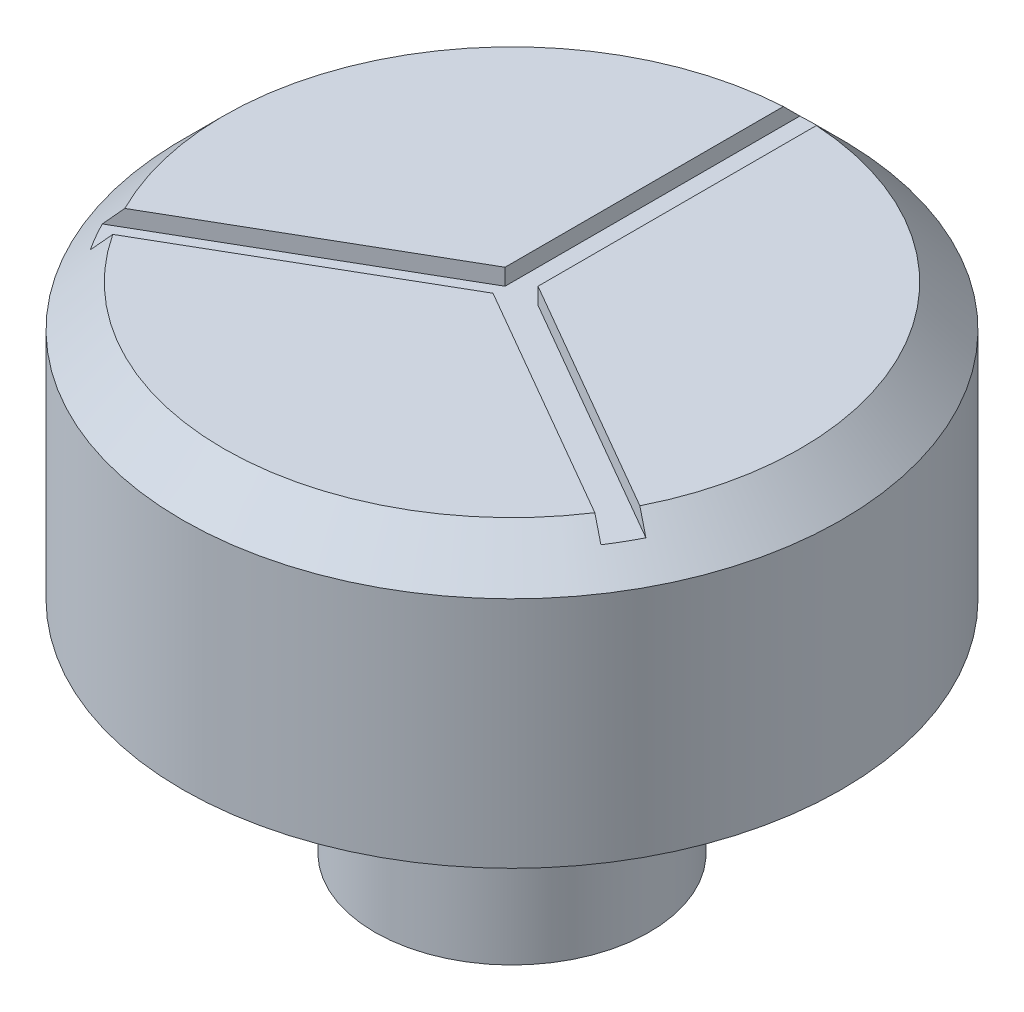
ISO-10303-21;
HEADER;
FILE_DESCRIPTION(('STEP AP214'),'2;1');
FILE_NAME('part.step','',(''),(''),'','','');
FILE_SCHEMA(('AUTOMOTIVE_DESIGN { 1 0 10303 214 1 1 1 1 }'));
ENDSEC;
DATA;
#1=APPLICATION_CONTEXT('core data for automotive mechanical design processes');
#2=APPLICATION_PROTOCOL_DEFINITION('international standard','automotive_design',2000,#1);
#3=PRODUCT_CONTEXT('',#1,'mechanical');
#4=PRODUCT('Part','Part','',(#3));
#5=PRODUCT_RELATED_PRODUCT_CATEGORY('part','',(#4));
#6=PRODUCT_DEFINITION_FORMATION('','',#4);
#7=PRODUCT_DEFINITION_CONTEXT('part definition',#1,'design');
#8=PRODUCT_DEFINITION('design','',#6,#7);
#9=PRODUCT_DEFINITION_SHAPE('','',#8);
#10=(LENGTH_UNIT() NAMED_UNIT(*) SI_UNIT(.MILLI.,.METRE.));
#11=(NAMED_UNIT(*) PLANE_ANGLE_UNIT() SI_UNIT($,.RADIAN.));
#12=(NAMED_UNIT(*) SI_UNIT($,.STERADIAN.) SOLID_ANGLE_UNIT());
#13=UNCERTAINTY_MEASURE_WITH_UNIT(LENGTH_MEASURE(1.E-05),#10,'distance_accuracy_value','');
#14=(GEOMETRIC_REPRESENTATION_CONTEXT(3) GLOBAL_UNCERTAINTY_ASSIGNED_CONTEXT((#13)) GLOBAL_UNIT_ASSIGNED_CONTEXT((#10,
#11,#12)) REPRESENTATION_CONTEXT('',''));
#15=CARTESIAN_POINT('',(0.,0.,0.));
#16=DIRECTION('',(0.,0.,1.));
#17=DIRECTION('',(1.,0.,0.));
#18=AXIS2_PLACEMENT_3D('',#15,#16,#17);
#19=CARTESIAN_POINT('',(0.,90.,0.));
#20=DIRECTION('',(0.,1.,0.));
#21=DIRECTION('',(0.,0.,1.));
#22=AXIS2_PLACEMENT_3D('',#19,#20,#21);
#23=PLANE('',#22);
#24=DIRECTION('',(-0.866025403784439,0.,0.5));
#25=VECTOR('',#24,1.);
#26=CARTESIAN_POINT('',(-3.,90.,-1.73205080756887));
#27=LINE('',#26,#25);
#28=CARTESIAN_POINT('',(-3.,90.,-1.73205080756887));
#29=VERTEX_POINT('',#28);
#30=CARTESIAN_POINT('',(-46.892042254122,90.,23.6090316031309));
#31=VERTEX_POINT('',#30);
#32=EDGE_CURVE('E122',#29,#31,#27,.T.);
#33=ORIENTED_EDGE('',*,*,#32,.F.);
#34=DIRECTION('',(0.,0.,1.));
#35=VECTOR('',#34,1.);
#36=CARTESIAN_POINT('',(-3.,90.,-60.));
#37=LINE('',#36,#35);
#38=CARTESIAN_POINT('',(-3.,90.,-52.4142156289684));
#39=VERTEX_POINT('',#38);
#40=EDGE_CURVE('E165',#39,#29,#37,.T.);
#41=ORIENTED_EDGE('',*,*,#40,.F.);
#42=CARTESIAN_POINT('',(0.,90.,0.));
#43=DIRECTION('',(0.,1.,0.));
#44=DIRECTION('',(0.,0.,1.));
#45=AXIS2_PLACEMENT_3D('',#42,#43,#44);
#46=CIRCLE('',#45,52.5);
#47=EDGE_CURVE('E193',#39,#31,#46,.T.);
#48=ORIENTED_EDGE('',*,*,#47,.T.);
#49=EDGE_LOOP('',(#33,#41,#48));
#50=FACE_BOUND('',#49,.T.);
#51=ADVANCED_FACE('F41',(#50),#23,.T.);
#52=DIRECTION('',(0.,0.,-1.));
#53=VECTOR('',#52,1.);
#54=CARTESIAN_POINT('',(3.,90.,-60.));
#55=LINE('',#54,#53);
#56=CARTESIAN_POINT('',(3.00000000000001,90.,-1.73205080756886));
#57=VERTEX_POINT('',#56);
#58=CARTESIAN_POINT('',(3.,90.,-52.4142156289684));
#59=VERTEX_POINT('',#58);
#60=EDGE_CURVE('E162',#57,#59,#55,.T.);
#61=ORIENTED_EDGE('',*,*,#60,.F.);
#62=DIRECTION('',(-0.866025403784439,0.,-0.5));
#63=VECTOR('',#62,1.);
#64=CARTESIAN_POINT('',(3.00000000000001,90.,-1.73205080756886));
#65=LINE('',#64,#63);
#66=CARTESIAN_POINT('',(46.892042254122,90.,23.6090316031309));
#67=VERTEX_POINT('',#66);
#68=EDGE_CURVE('E159',#67,#57,#65,.T.);
#69=ORIENTED_EDGE('',*,*,#68,.F.);
#70=EDGE_CURVE('E194',#67,#59,#46,.T.);
#71=ORIENTED_EDGE('',*,*,#70,.T.);
#72=EDGE_LOOP('',(#61,#69,#71));
#73=FACE_BOUND('',#72,.T.);
#74=ADVANCED_FACE('F262',(#73),#23,.T.);
#75=CARTESIAN_POINT('',(0.,40.,0.));
#76=DIRECTION('',(0.,-1.,0.));
#77=DIRECTION('',(0.,0.,-1.));
#78=AXIS2_PLACEMENT_3D('',#75,#76,#77);
#79=CYLINDRICAL_SURFACE('',#78,25.);
#80=CARTESIAN_POINT('',(0.,40.,0.));
#81=DIRECTION('',(0.,1.,0.));
#82=DIRECTION('',(0.,0.,1.));
#83=AXIS2_PLACEMENT_3D('',#80,#81,#82);
#84=CIRCLE('',#83,25.);
#85=CARTESIAN_POINT('',(0.,40.,25.));
#86=VERTEX_POINT('',#85);
#87=EDGE_CURVE('E182',#86,#86,#84,.T.);
#88=ORIENTED_EDGE('',*,*,#87,.F.);
#89=EDGE_LOOP('',(#88));
#90=FACE_BOUND('',#89,.T.);
#91=CARTESIAN_POINT('',(0.,0.,0.));
#92=DIRECTION('',(0.,1.,0.));
#93=DIRECTION('',(0.,0.,1.));
#94=AXIS2_PLACEMENT_3D('',#91,#92,#93);
#95=CIRCLE('',#94,25.);
#96=CARTESIAN_POINT('',(0.,0.,25.));
#97=VERTEX_POINT('',#96);
#98=EDGE_CURVE('E181',#97,#97,#95,.T.);
#99=ORIENTED_EDGE('',*,*,#98,.T.);
#100=EDGE_LOOP('',(#99));
#101=FACE_BOUND('',#100,.T.);
#102=ADVANCED_FACE('F267',(#90,#101),#79,.T.);
#103=CARTESIAN_POINT('',(0.,0.,0.));
#104=DIRECTION('',(0.,1.,0.));
#105=DIRECTION('',(0.,0.,1.));
#106=AXIS2_PLACEMENT_3D('',#103,#104,#105);
#107=PLANE('',#106);
#108=ORIENTED_EDGE('',*,*,#98,.F.);
#109=EDGE_LOOP('',(#108));
#110=FACE_BOUND('',#109,.T.);
#111=ADVANCED_FACE('F279',(#110),#107,.F.);
#112=CARTESIAN_POINT('',(0.,90.,0.));
#113=DIRECTION('',(0.,-1.,0.));
#114=DIRECTION('',(0.,0.,-1.));
#115=AXIS2_PLACEMENT_3D('',#112,#113,#114);
#116=CYLINDRICAL_SURFACE('',#115,60.);
#117=CARTESIAN_POINT('',(0.,82.5,0.));
#118=DIRECTION('',(0.,1.,0.));
#119=DIRECTION('',(0.,0.,1.));
#120=AXIS2_PLACEMENT_3D('',#117,#118,#119);
#121=CIRCLE('',#120,60.);
#122=CARTESIAN_POINT('',(0.,82.5,60.));
#123=VERTEX_POINT('',#122);
#124=EDGE_CURVE('E195',#123,#123,#121,.F.);
#125=ORIENTED_EDGE('',*,*,#124,.T.);
#126=EDGE_LOOP('',(#125));
#127=FACE_BOUND('',#126,.T.);
#128=CARTESIAN_POINT('',(0.,40.,0.));
#129=DIRECTION('',(0.,1.,0.));
#130=DIRECTION('',(0.,0.,1.));
#131=AXIS2_PLACEMENT_3D('',#128,#129,#130);
#132=CIRCLE('',#131,60.);
#133=CARTESIAN_POINT('',(0.,40.,60.));
#134=VERTEX_POINT('',#133);
#135=EDGE_CURVE('E174',#134,#134,#132,.T.);
#136=ORIENTED_EDGE('',*,*,#135,.T.);
#137=EDGE_LOOP('',(#136));
#138=FACE_BOUND('',#137,.T.);
#139=ADVANCED_FACE('F272',(#127,#138),#116,.T.);
#140=DIRECTION('',(0.866025403784439,0.,0.5));
#141=VECTOR('',#140,1.);
#142=CARTESIAN_POINT('',(0.,90.,3.46410161513776));
#143=LINE('',#142,#141);
#144=CARTESIAN_POINT('',(0.,90.,3.46410161513776));
#145=VERTEX_POINT('',#144);
#146=CARTESIAN_POINT('',(43.892042254122,90.,28.8051840258375));
#147=VERTEX_POINT('',#146);
#148=EDGE_CURVE('E156',#145,#147,#143,.T.);
#149=ORIENTED_EDGE('',*,*,#148,.F.);
#150=DIRECTION('',(0.866025403784438,0.,-0.5));
#151=VECTOR('',#150,1.);
#152=CARTESIAN_POINT('',(0.,90.,3.46410161513776));
#153=LINE('',#152,#151);
#154=CARTESIAN_POINT('',(-43.892042254122,90.,28.8051840258375));
#155=VERTEX_POINT('',#154);
#156=EDGE_CURVE('E128',#155,#145,#153,.T.);
#157=ORIENTED_EDGE('',*,*,#156,.F.);
#158=EDGE_CURVE('E186',#155,#147,#46,.T.);
#159=ORIENTED_EDGE('',*,*,#158,.T.);
#160=EDGE_LOOP('',(#149,#157,#159));
#161=FACE_BOUND('',#160,.T.);
#162=ADVANCED_FACE('F226',(#161),#23,.T.);
#163=CARTESIAN_POINT('',(0.,40.,0.));
#164=DIRECTION('',(0.,1.,0.));
#165=DIRECTION('',(0.,0.,1.));
#166=AXIS2_PLACEMENT_3D('',#163,#164,#165);
#167=PLANE('',#166);
#168=ORIENTED_EDGE('',*,*,#87,.T.);
#169=EDGE_LOOP('',(#168));
#170=FACE_BOUND('',#169,.T.);
#171=ORIENTED_EDGE('',*,*,#135,.F.);
#172=EDGE_LOOP('',(#171));
#173=FACE_BOUND('',#172,.T.);
#174=ADVANCED_FACE('F271',(#170,#173),#167,.F.);
#175=CARTESIAN_POINT('',(0.,90.,0.));
#176=DIRECTION('',(0.,-1.,0.));
#177=DIRECTION('',(0.,0.,-1.));
#178=AXIS2_PLACEMENT_3D('',#175,#176,#177);
#179=CONICAL_SURFACE('',#178,52.5,0.785398163397446);
#180=CARTESIAN_POINT('',(-46.891868765562,90.0002,23.608931439464));
#181=CARTESIAN_POINT('',(-47.3256282311231,89.5001548888933,23.8593625836693));
#182=CARTESIAN_POINT('',(-47.7593783772765,89.0000990000034,24.109788347312));
#183=CARTESIAN_POINT('',(-48.6268600307568,87.9999656666701,24.610629113466));
#184=CARTESIAN_POINT('',(-49.0605915380837,87.4998882222266,24.8610441159772));
#185=CARTESIAN_POINT('',(-49.494313726003,86.9998,25.1114537379259));
#186=B_SPLINE_CURVE_WITH_KNOTS('',3,(#180,#181,#182,#183,#184,#185),.UNSPECIFIED.,.F.,.F.,(4,2,
4),(0.,2.12324593478444,4.24649186951425),.UNSPECIFIED.);
#187=CARTESIAN_POINT('',(-49.4941402673285,87.,25.1113535915134));
#188=VERTEX_POINT('',#187);
#189=EDGE_CURVE('E12',#31,#188,#186,.T.);
#190=ORIENTED_EDGE('',*,*,#189,.F.);
#191=ORIENTED_EDGE('',*,*,#47,.F.);
#192=CARTESIAN_POINT('',(-3.,28.6546724991389,-113.805793322564));
#193=CARTESIAN_POINT('',(-3.,32.5771081363212,-109.88198425068));
#194=CARTESIAN_POINT('',(-3.,36.4994835739966,-105.95811499398));
#195=CARTESIAN_POINT('',(-3.,44.3440383251556,-98.1101763953065));
#196=CARTESIAN_POINT('',(-3.,48.266217638537,-94.1861070532297));
#197=CARTESIAN_POINT('',(-3.,56.1103465601324,-86.3376463995405));
#198=CARTESIAN_POINT('',(-3.,60.0322961650969,-82.4132550846804));
#199=CARTESIAN_POINT('',(-3.,67.8757715089384,-74.5640528356237));
#200=CARTESIAN_POINT('',(-3.,71.7972972480274,-70.6392419016389));
#201=CARTESIAN_POINT('',(-3.,79.6527550806662,-62.775856675003));
#202=CARTESIAN_POINT('',(-3.,83.5866849284327,-58.8372801385907));
#203=CARTESIAN_POINT('',(-3.,89.4866615760587,-52.928492446666));
#204=CARTESIAN_POINT('',(-3.,91.4531689645908,-50.9587412049122));
#205=CARTESIAN_POINT('',(-3.,95.3857449112603,-47.0188012682104));
#206=CARTESIAN_POINT('',(-3.,97.3518134694634,-45.048612573328));
#207=CARTESIAN_POINT('',(-3.,101.283294495592,-41.1076093506152));
#208=CARTESIAN_POINT('',(-3.,103.248706968202,-39.1367948274577));
#209=CARTESIAN_POINT('',(-3.,107.178548361012,-35.1941828853038));
#210=CARTESIAN_POINT('',(-3.,109.142977280644,-33.2223854657411));
#211=CARTESIAN_POINT('',(-3.,112.088366398078,-30.2634459610777));
#212=CARTESIAN_POINT('',(-3.,113.069952424592,-29.2769268741391));
#213=CARTESIAN_POINT('',(-3.,115.032555218023,-27.303322653048));
#214=CARTESIAN_POINT('',(-3.,116.013571984978,-26.3162375189322));
#215=CARTESIAN_POINT('',(-3.,117.974815882029,-24.3412848485979));
#216=CARTESIAN_POINT('',(-3.,118.95504301286,-23.3534173131081));
#217=CARTESIAN_POINT('',(-3.,120.914361924385,-21.3765570968834));
#218=CARTESIAN_POINT('',(-3.,121.893453705493,-20.3875644165587));
#219=CARTESIAN_POINT('',(-3.,123.139257599978,-19.1269449173635));
#220=CARTESIAN_POINT('',(-3.,123.406775889076,-18.8561147835616));
#221=CARTESIAN_POINT('',(-3.,123.941661684624,-18.3143056222084));
#222=CARTESIAN_POINT('',(-3.,124.209029191061,-18.043326594645));
#223=CARTESIAN_POINT('',(-3.,125.010876243449,-17.2301369497604));
#224=CARTESIAN_POINT('',(-3.,125.545100043531,-16.6876740524236));
#225=CARTESIAN_POINT('',(-3.,126.612438689274,-15.6020652169645));
#226=CARTESIAN_POINT('',(-3.,127.145553880324,-15.0589196184898));
#227=CARTESIAN_POINT('',(-3.,128.210549559521,-13.9714197400147));
#228=CARTESIAN_POINT('',(-3.,128.742430049214,-13.427065461529));
#229=CARTESIAN_POINT('',(-3.,129.628642018202,-12.5171346509366));
#230=CARTESIAN_POINT('',(-3.,129.983459928519,-12.1520319766619));
#231=CARTESIAN_POINT('',(-3.,130.692068972975,-11.4208315367535));
#232=CARTESIAN_POINT('',(-3.,131.045860107909,-11.0547337718902));
#233=CARTESIAN_POINT('',(-3.,131.752335858881,-10.3209557471611));
#234=CARTESIAN_POINT('',(-3.,132.105019477402,-9.95327452637883));
#235=CARTESIAN_POINT('',(-3.,132.808516350274,-9.21612929706473));
#236=CARTESIAN_POINT('',(-3.,133.159329617939,-8.84666530126139));
#237=CARTESIAN_POINT('',(-3.,133.742885235197,-8.22762929172703));
#238=CARTESIAN_POINT('',(-3.,133.976364639775,-7.97875244162946));
#239=CARTESIAN_POINT('',(-3.,134.441755548663,-7.47953782881372));
#240=CARTESIAN_POINT('',(-3.,134.673667061965,-7.2292000744906));
#241=CARTESIAN_POINT('',(-3.,135.134923513044,-6.72712180265373));
#242=CARTESIAN_POINT('',(-3.,135.364272763855,-6.47538525234007));
#243=CARTESIAN_POINT('',(-3.,135.82010987478,-5.96934387585617));
#244=CARTESIAN_POINT('',(-3.,136.04659784758,-5.71503915154337));
#245=CARTESIAN_POINT('',(-3.,136.421236752235,-5.28754564820007));
#246=CARTESIAN_POINT('',(-3.,136.570519139001,-5.11534970154422));
#247=CARTESIAN_POINT('',(-3.,136.866693048689,-4.76888329835832));
#248=CARTESIAN_POINT('',(-3.,137.013584363691,-4.59461266367714));
#249=CARTESIAN_POINT('',(-3.,137.305111612511,-4.24225648287777));
#250=CARTESIAN_POINT('',(-3.,137.449726473352,-4.06415342638635));
#251=CARTESIAN_POINT('',(-3.,137.734426665212,-3.70442749958706));
#252=CARTESIAN_POINT('',(-3.,137.874513181237,-3.52280557034623));
#253=CARTESIAN_POINT('',(-3.,138.150234087227,-3.15216014153438));
#254=CARTESIAN_POINT('',(-3.,138.285778029672,-2.96306843648767));
#255=CARTESIAN_POINT('',(-3.,138.481734185859,-2.67421370691163));
#256=CARTESIAN_POINT('',(-3.,138.545872482153,-2.57698294832374));
#257=CARTESIAN_POINT('',(-3.,138.67100993584,-2.38052845286746));
#258=CARTESIAN_POINT('',(-3.,138.732009387365,-2.2813049039531));
#259=CARTESIAN_POINT('',(-3.,138.849491780786,-2.08150676414158));
#260=CARTESIAN_POINT('',(-3.,138.90601341281,-1.98095522863322));
#261=CARTESIAN_POINT('',(-3.,139.014144056181,-1.77725847838132));
#262=CARTESIAN_POINT('',(-3.,139.065752098671,-1.67411275716619));
#263=CARTESIAN_POINT('',(-3.,139.211000640339,-1.36077737140003));
#264=CARTESIAN_POINT('',(-3.,139.295507600292,-1.14597345671841));
#265=CARTESIAN_POINT('',(-3.,139.39028772941,-0.824380297110711));
#266=CARTESIAN_POINT('',(-3.,139.415975674042,-0.722111619281172));
#267=CARTESIAN_POINT('',(-3.,139.457696160746,-0.515586564113805));
#268=CARTESIAN_POINT('',(-3.,139.473729984717,-0.411330452570034));
#269=CARTESIAN_POINT('',(-3.,139.494985685525,-0.202176661674427));
#270=CARTESIAN_POINT('',(-3.,139.500255924252,-0.0972839854247208));
#271=CARTESIAN_POINT('',(-3.,139.499724838068,0.112477817497646));
#272=CARTESIAN_POINT('',(-3.,139.493923105841,0.217346943161985));
#273=CARTESIAN_POINT('',(-3.,139.471757204019,0.425314988725473));
#274=CARTESIAN_POINT('',(-3.,139.455455212973,0.528420685107388));
#275=CARTESIAN_POINT('',(-3.,139.41344058127,0.732705317921857));
#276=CARTESIAN_POINT('',(-3.,139.387723948527,0.833883417821517));
#277=CARTESIAN_POINT('',(-3.,139.328114809184,1.0344535512463));
#278=CARTESIAN_POINT('',(-3.,139.294172264298,1.13383049147631));
#279=CARTESIAN_POINT('',(-3.,139.219649832736,1.33000875207042));
#280=CARTESIAN_POINT('',(-3.,139.179071055855,1.42681049994934));
#281=CARTESIAN_POINT('',(-3.,139.057049963726,1.69649520271028));
#282=CARTESIAN_POINT('',(-3.,138.969418394799,1.86656691089793));
#283=CARTESIAN_POINT('',(-3.,138.782283500498,2.20010560738561));
#284=CARTESIAN_POINT('',(-3.,138.682766803852,2.36356487441742));
#285=CARTESIAN_POINT('',(-3.,138.475264727877,2.68583800879828));
#286=CARTESIAN_POINT('',(-3.,138.367248985817,2.84463215373613));
#287=CARTESIAN_POINT('',(-3.,138.145555761685,3.15807417578193));
#288=CARTESIAN_POINT('',(-3.,138.031880813425,3.3127238616279));
#289=CARTESIAN_POINT('',(-3.,137.799256681893,3.62038801803557));
#290=CARTESIAN_POINT('',(-3.,137.680266601481,3.77337141584441));
#291=CARTESIAN_POINT('',(-3.,137.439144056139,4.07685442507549));
#292=CARTESIAN_POINT('',(-3.,137.317011302697,4.22735380635701));
#293=CARTESIAN_POINT('',(-3.,137.070657251492,4.52602147249156));
#294=CARTESIAN_POINT('',(-3.,136.94644167372,4.67419448750418));
#295=CARTESIAN_POINT('',(-3.,136.696164025874,4.96895879866776));
#296=CARTESIAN_POINT('',(-3.,136.570102032633,5.1155501601962));
#297=CARTESIAN_POINT('',(-3.,136.195083570525,5.54726386659154));
#298=CARTESIAN_POINT('',(-3.,135.944064104521,5.83059291131982));
#299=CARTESIAN_POINT('',(-3.,135.438330206678,6.39393917369138));
#300=CARTESIAN_POINT('',(-3.,135.183615614295,6.67395624647389));
#301=CARTESIAN_POINT('',(-3.,134.671560166882,7.2316433672337));
#302=CARTESIAN_POINT('',(-3.,134.414218972034,7.50931310280569));
#303=CARTESIAN_POINT('',(-3.,133.897651970385,8.06289455838185));
#304=CARTESIAN_POINT('',(-3.,133.638426151128,8.33880626674381));
#305=CARTESIAN_POINT('',(-3.,133.1182530822,8.88962234986746));
#306=CARTESIAN_POINT('',(-3.,132.857304151658,9.16452513599661));
#307=CARTESIAN_POINT('',(-3.,132.334314630735,9.71329164619267));
#308=CARTESIAN_POINT('',(-3.,132.072274035998,9.98715536610529));
#309=CARTESIAN_POINT('',(-3.,131.284923814447,10.8074821571537));
#310=CARTESIAN_POINT('',(-3.,130.758343564413,11.3527253611228));
#311=CARTESIAN_POINT('',(-3.,129.708501495062,12.4354165801651));
#312=CARTESIAN_POINT('',(-3.,129.185262325512,12.9728865955563));
#313=CARTESIAN_POINT('',(-3.,128.137288876827,14.0463874870134));
#314=CARTESIAN_POINT('',(-3.,127.612554568059,14.5824183341416));
#315=CARTESIAN_POINT('',(-3.,126.562275886713,15.653174557732));
#316=CARTESIAN_POINT('',(-3.,126.036732031402,16.1879004418287));
#317=CARTESIAN_POINT('',(-3.,124.984855389767,17.256568777727));
#318=CARTESIAN_POINT('',(-3.,124.458522608491,17.7905112344981));
#319=CARTESIAN_POINT('',(-3.,123.149411754689,19.1170540840146));
#320=CARTESIAN_POINT('',(-3.,122.366270798736,19.9092963093958));
#321=CARTESIAN_POINT('',(-3.,120.799065234405,21.4928667889256));
#322=CARTESIAN_POINT('',(-3.,120.015000625748,22.2841950427969));
#323=CARTESIAN_POINT('',(-3.,117.661812810406,24.6572036207076));
#324=CARTESIAN_POINT('',(-3.,116.091700418265,26.2379029004831));
#325=CARTESIAN_POINT('',(-3.,112.949647786289,29.3981529492179));
#326=CARTESIAN_POINT('',(-3.,111.377707228194,30.9777034015721));
#327=CARTESIAN_POINT('',(-3.,108.232877558684,34.1358560305017));
#328=CARTESIAN_POINT('',(-3.,106.659988448379,35.714458208182));
#329=CARTESIAN_POINT('',(-3.,103.480863864114,38.9038505097183));
#330=CARTESIAN_POINT('',(-3.,101.874615090443,40.514627374775));
#331=CARTESIAN_POINT('',(-3.,98.661656404826,43.7357223747715));
#332=CARTESIAN_POINT('',(-3.,97.0549464926988,45.3460405095304));
#333=CARTESIAN_POINT('',(-3.,93.841553270234,48.5659861795509));
#334=CARTESIAN_POINT('',(-3.00000000000001,92.2348700339632,50.1756137887327));
#335=CARTESIAN_POINT('',(-3.00000000000001,89.0212510807533,53.3946155542823));
#336=CARTESIAN_POINT('',(-3.00000000000001,87.4143153639243,55.00398971076));
#337=CARTESIAN_POINT('',(-3.00000000000001,85.8072923741398,56.6132766932922));
#338=B_SPLINE_CURVE_WITH_KNOTS('',3,(#192,#193,#194,#195,#196,#197,#198,#199,#200,#201,#202,
#203,#204,#205,#206,#207,#208,#209,#210,#211,#212,#213,#214,#215,#216,#217,#218,#219,#220,#221,
#222,#223,#224,#225,#226,#227,#228,#229,#230,#231,#232,#233,#234,#235,#236,#237,#238,#239,#240,
#241,#242,#243,#244,#245,#246,#247,#248,#249,#250,#251,#252,#253,#254,#255,#256,#257,#258,#259,
#260,#261,#262,#263,#264,#265,#266,#267,#268,#269,#270,#271,#272,#273,#274,#275,#276,#277,#278,
#279,#280,#281,#282,#283,#284,#285,#286,#287,#288,#289,#290,#291,#292,#293,#294,#295,#296,#297,
#298,#299,#300,#301,#302,#303,#304,#305,#306,#307,#308,#309,#310,#311,#312,#313,#314,#315,#316,
#317,#318,#319,#320,#321,#322,#323,#324,#325,#326,#327,#328,#329,#330,#331,#332,#333,#334,#335,
#336,#337),.UNSPECIFIED.,.F.,.F.,(4,2,2,2,2,2,2,2,2,2,2,2,2,2,2,2,2,2,2,2,2,2,2,2,2,2,2,2,2,2,2,
2,2,2,2,2,2,2,2,2,2,2,2,2,2,2,2,2,2,2,2,2,2,2,2,2,2,2,2,2,2,2,2,2,2,2,2,2,2,2,2,2,4),(0.,
16.6443987826526,33.288806152046,49.9334095494186,66.5780045840452,83.2781152542221,
91.6281835571832,99.9782506096114,108.32825671702,116.678267640132,120.853262016475,
125.028256122395,129.203246344551,133.378235045037,134.520266063712,135.662297174477,
137.946360586347,140.229552386014,142.512741326023,144.04007790039,145.567413292487,
147.095864788927,148.624305388759,149.648053880981,150.671796496032,151.69342382333,
152.71501078934,153.398682970566,154.082414287575,154.770623754274,155.458651643531,
156.156366140993,156.505757926954,156.855116912658,157.201021969547,157.546995091057,
158.2364262856,158.552390990984,158.868313732498,159.182813849884,159.497325537315,
159.809991717732,160.122790631715,160.437542294061,160.752241373342,161.325405469758,
161.899220584631,162.475187849848,163.050899515143,163.632277190424,164.213708430569,
164.793743366527,165.373754234243,166.509292049237,167.644879348668,168.780615475566,
169.916359115849,171.053453736101,172.190552897789,174.464567267594,176.714870486003,
178.965218618026,181.214473700145,183.463714452467,186.805661413515,190.147609388221,
196.831525839401,203.516866909223,210.202200174879,217.026548753578,223.85090001878,
230.673728475308,237.496553962779),.UNSPECIFIED.);
#339=CARTESIAN_POINT('',(-3.,87.,-55.4188596057335));
#340=VERTEX_POINT('',#339);
#341=EDGE_CURVE('E234',#340,#39,#338,.T.);
#342=ORIENTED_EDGE('',*,*,#341,.F.);
#343=CARTESIAN_POINT('',(0.,87.,0.));
#344=DIRECTION('',(0.,1.,0.));
#345=DIRECTION('',(0.,0.,1.));
#346=AXIS2_PLACEMENT_3D('',#343,#344,#345);
#347=CIRCLE('',#346,55.5);
#348=CARTESIAN_POINT('',(3.,87.,-55.4188596057335));
#349=VERTEX_POINT('',#348);
#350=EDGE_CURVE('E202',#340,#349,#347,.F.);
#351=ORIENTED_EDGE('',*,*,#350,.T.);
#352=CARTESIAN_POINT('',(3.00000000000001,85.8072923741398,56.6132766932922));
#353=CARTESIAN_POINT('',(3.00000000000001,87.7365497359716,54.6812918607368));
#354=CARTESIAN_POINT('',(3.00000000000001,89.6656881888759,52.7491882389316));
#355=CARTESIAN_POINT('',(3.00000000000001,93.5235936735059,48.8845774480433));
#356=CARTESIAN_POINT('',(3.00000000000001,95.4523607019365,46.9520702756707));
#357=CARTESIAN_POINT('',(3.00000000000001,99.309728334789,43.0861470268028));
#358=CARTESIAN_POINT('',(3.00000000000001,101.238328835628,41.1527308469415));
#359=CARTESIAN_POINT('',(3.00000000000001,105.094695452693,37.2850984679454));
#360=CARTESIAN_POINT('',(3.00000000000001,107.022461575699,35.3508822755719));
#361=CARTESIAN_POINT('',(3.00000000000001,110.928774631,31.4288810385406));
#362=CARTESIAN_POINT('',(3.00000000000001,112.907286187199,29.4410607438727));
#363=CARTESIAN_POINT('',(3.00000000000001,115.873218060736,26.4574544245535));
#364=CARTESIAN_POINT('',(3.00000000000001,116.861568866858,25.4625934720631));
#365=CARTESIAN_POINT('',(3.00000000000001,118.837379719484,23.4719921549926));
#366=CARTESIAN_POINT('',(3.00000000000001,119.824839768232,22.4762517926398));
#367=CARTESIAN_POINT('',(3.00000000000001,121.798334923404,20.483601254531));
#368=CARTESIAN_POINT('',(3.00000000000001,122.784370189468,19.4866912369014));
#369=CARTESIAN_POINT('',(3.00000000000001,124.754442283324,17.4908772467125));
#370=CARTESIAN_POINT('',(3.00000000000001,125.738479091619,16.4919732548867));
#371=CARTESIAN_POINT('',(3.00000000000001,127.211942660176,14.9911159410595));
#372=CARTESIAN_POINT('',(3.00000000000001,127.702654380951,14.4904244215172));
#373=CARTESIAN_POINT('',(3.00000000000001,128.682903722828,13.4878937022054));
#374=CARTESIAN_POINT('',(3.00000000000001,129.172441345197,12.9860545036765));
#375=CARTESIAN_POINT('',(3.00000000000001,130.149873798977,11.9807935063359));
#376=CARTESIAN_POINT('',(3.00000000000001,130.637768655965,11.4773717324024));
#377=CARTESIAN_POINT('',(3.00000000000001,131.611187737664,10.4682425260199));
#378=CARTESIAN_POINT('',(3.00000000000001,132.096711976982,9.96253510769098));
#379=CARTESIAN_POINT('',(3.00000000000001,132.710991172337,9.31806699448562));
#380=CARTESIAN_POINT('',(3.00000000000001,132.841449192943,9.18092946472452));
#381=CARTESIAN_POINT('',(3.00000000000001,133.102055068726,8.9063597137517));
#382=CARTESIAN_POINT('',(3.00000000000001,133.232202923496,8.76892749215355));
#383=CARTESIAN_POINT('',(3.00000000000001,133.622122940229,8.35612895059291));
#384=CARTESIAN_POINT('',(3.00000000000001,133.88136827427,8.08026419133361));
#385=CARTESIAN_POINT('',(3.00000000000001,134.397288623852,7.52753242373495));
#386=CARTESIAN_POINT('',(3.00000000000001,134.653968689904,7.25067013369019));
#387=CARTESIAN_POINT('',(3.00000000000001,135.16476969325,6.6946052055386));
#388=CARTESIAN_POINT('',(3.00000000000001,135.41889071561,6.41540264579529));
#389=CARTESIAN_POINT('',(3.00000000000001,135.840064145513,5.9465560823378));
#390=CARTESIAN_POINT('',(3.00000000000001,136.008126536171,5.75782031100634));
#391=CARTESIAN_POINT('',(3.00000000000001,136.342102084937,5.37845895716968));
#392=CARTESIAN_POINT('',(3.00000000000001,136.508015280365,5.18783340758205));
#393=CARTESIAN_POINT('',(3.00000000000001,136.837818906704,4.80314158250248));
#394=CARTESIAN_POINT('',(3.00000000000001,137.001694703509,4.60906271643055));
#395=CARTESIAN_POINT('',(3.00000000000001,137.325405674953,4.2176459753546));
#396=CARTESIAN_POINT('',(3.00000000000001,137.485241961099,4.02030902210446));
#397=CARTESIAN_POINT('',(3.00000000000001,137.800762760884,3.61917445057103));
#398=CARTESIAN_POINT('',(3.00000000000001,137.95639173004,3.41533264686104));
#399=CARTESIAN_POINT('',(3.00000000000001,138.183339009892,3.10459640844998));
#400=CARTESIAN_POINT('',(3.00000000000001,138.257955512379,3.00011362666459));
#401=CARTESIAN_POINT('',(3.00000000000001,138.40439875496,2.78921589937788));
#402=CARTESIAN_POINT('',(3.00000000000001,138.476225740045,2.68280112476443));
#403=CARTESIAN_POINT('',(3.00000000000001,138.615877970117,2.46839524566087));
#404=CARTESIAN_POINT('',(3.00000000000001,138.683727101936,2.36041977711386));
#405=CARTESIAN_POINT('',(3.00000000000001,138.814973940027,2.1417448202142));
#406=CARTESIAN_POINT('',(3.00000000000001,138.878370684102,2.03104474999119));
#407=CARTESIAN_POINT('',(3.00000000000001,138.999216908926,1.80676172444485));
#408=CARTESIAN_POINT('',(3.00000000000001,139.056680325488,1.6931863423495));
#409=CARTESIAN_POINT('',(3.00000000000001,139.164039654407,1.46254457202508));
#410=CARTESIAN_POINT('',(3.00000000000001,139.213940477532,1.34548050878839));
#411=CARTESIAN_POINT('',(3.00000000000001,139.293027779795,1.13649070032029));
#412=CARTESIAN_POINT('',(3.00000000000001,139.324302270731,1.04535967643852));
#413=CARTESIAN_POINT('',(3.00000000000001,139.380119317829,0.861026312130608));
#414=CARTESIAN_POINT('',(3.00000000000001,139.404661638802,0.767823899463347));
#415=CARTESIAN_POINT('',(3.00000000000001,139.445802339581,0.580060923592637));
#416=CARTESIAN_POINT('',(3.00000000000001,139.462433189492,0.485507581364389));
#417=CARTESIAN_POINT('',(3.00000000000001,139.486979296506,0.295267204632333));
#418=CARTESIAN_POINT('',(3.00000000000001,139.494895518927,0.199580296880593));
#419=CARTESIAN_POINT('',(3.00000000000001,139.501541135905,0.0072365585195351));
#420=CARTESIAN_POINT('',(3.00000000000001,139.500208375313,-0.0894224667843054));
#421=CARTESIAN_POINT('',(3.00000000000001,139.488296381705,-0.282162055240762));
#422=CARTESIAN_POINT('',(3.00000000000001,139.47771669209,-0.378242589592462));
#423=CARTESIAN_POINT('',(3.00000000000001,139.447916591264,-0.569349705021032));
#424=CARTESIAN_POINT('',(3.00000000000001,139.428668551502,-0.664371912719275));
#425=CARTESIAN_POINT('',(3.00000000000001,139.382553322941,-0.852524487780819));
#426=CARTESIAN_POINT('',(3.00000000000001,139.355685079133,-0.945654591270049));
#427=CARTESIAN_POINT('',(3.00000000000001,139.265902440036,-1.22033636038193));
#428=CARTESIAN_POINT('',(3.00000000000001,139.193518281999,-1.3988095312211));
#429=CARTESIAN_POINT('',(3.00000000000001,139.072047956396,-1.66036668302298));
#430=CARTESIAN_POINT('',(3.00000000000001,139.029358639814,-1.74661186544397));
#431=CARTESIAN_POINT('',(3.00000000000001,138.94042692312,-1.91725426627658));
#432=CARTESIAN_POINT('',(3.00000000000001,138.894185041871,-2.00165175224456));
#433=CARTESIAN_POINT('',(3.00000000000001,138.798435629985,-2.16941440852835));
#434=CARTESIAN_POINT('',(3.00000000000001,138.748905817498,-2.25276673718695));
#435=CARTESIAN_POINT('',(3.00000000000001,138.647419425984,-2.41797943484431));
#436=CARTESIAN_POINT('',(3.00000000000001,138.595462799445,-2.49983977458939));
#437=CARTESIAN_POINT('',(3.00000000000001,138.489588810845,-2.66217611193591));
#438=CARTESIAN_POINT('',(3.00000000000001,138.435673202249,-2.74265325697766));
#439=CARTESIAN_POINT('',(3.00000000000001,138.326169519987,-2.90245394634332));
#440=CARTESIAN_POINT('',(3.00000000000001,138.270581506929,-2.98177753231717));
#441=CARTESIAN_POINT('',(3.00000000000001,138.09212898251,-3.23167618368648));
#442=CARTESIAN_POINT('',(3.00000000000001,137.966666990372,-3.40039697966542));
#443=CARTESIAN_POINT('',(3.00000000000001,137.711106283199,-3.73430071086666));
#444=CARTESIAN_POINT('',(3.00000000000001,137.581006797369,-3.89948305059071));
#445=CARTESIAN_POINT('',(3.00000000000001,137.317360316529,-4.22720058799535));
#446=CARTESIAN_POINT('',(3.00000000000001,137.183811645673,-4.38973443384549));
#447=CARTESIAN_POINT('',(3.00000000000001,136.914170630993,-4.71268230242546));
#448=CARTESIAN_POINT('',(3.00000000000001,136.778078186859,-4.87309624113238));
#449=CARTESIAN_POINT('',(3.00000000000001,136.503694016804,-5.19253154367896));
#450=CARTESIAN_POINT('',(3.00000000000001,136.365398770901,-5.35154987859006));
#451=CARTESIAN_POINT('',(3.00000000000001,136.087266010423,-5.66823329031119));
#452=CARTESIAN_POINT('',(3.00000000000001,135.947428476466,-5.82589835007053));
#453=CARTESIAN_POINT('',(3.00000000000001,135.526174565708,-6.29715801025486));
#454=CARTESIAN_POINT('',(3.00000000000001,135.242929870152,-6.60911752611361));
#455=CARTESIAN_POINT('',(3.00000000000001,134.673996404648,-7.22920295655081));
#456=CARTESIAN_POINT('',(3.00000000000001,134.388316543633,-7.53733707845833));
#457=CARTESIAN_POINT('',(3.00000000000001,133.814665803292,-8.15150615619639));
#458=CARTESIAN_POINT('',(3.,133.526694755065,-8.45754095411336));
#459=CARTESIAN_POINT('',(3.,132.949422546376,-9.06770455857576));
#460=CARTESIAN_POINT('',(3.,132.660123229011,-9.37183511107696));
#461=CARTESIAN_POINT('',(3.,132.080288030658,-9.97889965355005));
#462=CARTESIAN_POINT('',(3.,131.789752181044,-10.2818336735097));
#463=CARTESIAN_POINT('',(3.,130.91957637722,-11.1863038251164));
#464=CARTESIAN_POINT('',(3.,130.338534384506,-11.7864905862134));
#465=CARTESIAN_POINT('',(3.,129.174098214,-12.9845791738853));
#466=CARTESIAN_POINT('',(3.,128.59070402563,-13.5824809901619));
#467=CARTESIAN_POINT('',(3.,127.422310915355,-14.776738019035));
#468=CARTESIAN_POINT('',(3.,126.837311960852,-15.3730931997289));
#469=CARTESIAN_POINT('',(3.,125.66618849945,-16.5646976182602));
#470=CARTESIAN_POINT('',(3.,125.080063991733,-17.1599468552946));
#471=CARTESIAN_POINT('',(3.,123.319948956267,-18.9450299075616));
#472=CARTESIAN_POINT('',(3.,122.144741779955,-20.1336638456853));
#473=CARTESIAN_POINT('',(3.,119.792476708044,-22.5090747104318));
#474=CARTESIAN_POINT('',(3.,118.6154188304,-23.6958516548515));
#475=CARTESIAN_POINT('',(3.,116.260321699402,-26.0680045807653));
#476=CARTESIAN_POINT('',(3.,115.082282662356,-27.2533807770358));
#477=CARTESIAN_POINT('',(3.,112.725399646614,-29.6233385628808));
#478=CARTESIAN_POINT('',(3.,111.546555665848,-30.8079201503972));
#479=CARTESIAN_POINT('',(3.,109.188476884408,-33.1763438628558));
#480=CARTESIAN_POINT('',(3.,108.009242167799,-34.3601860715023));
#481=CARTESIAN_POINT('',(3.,105.650357615644,-36.7274549292981));
#482=CARTESIAN_POINT('',(3.,104.470707780429,-37.9108815787774));
#483=CARTESIAN_POINT('',(3.,100.184259066335,-42.2099479509425));
#484=CARTESIAN_POINT('',(3.,97.0765571678156,-45.3246872593166));
#485=CARTESIAN_POINT('',(3.,90.860057958547,-51.5530742916577));
#486=CARTESIAN_POINT('',(3.,87.7512606474422,-54.6667220152695));
#487=CARTESIAN_POINT('',(3.,81.532808499543,-60.8935508015727));
#488=CARTESIAN_POINT('',(3.,78.4231536212163,-64.0067318227874));
#489=CARTESIAN_POINT('',(3.,72.2034214414368,-70.2326712204055));
#490=CARTESIAN_POINT('',(3.,69.0933441400257,-73.3454295968508));
#491=CARTESIAN_POINT('',(3.,62.8727129896952,-79.5708470725104));
#492=CARTESIAN_POINT('',(3.,59.762159123319,-82.6835061542812));
#493=CARTESIAN_POINT('',(3.,53.5408467972897,-88.9086200517264));
#494=CARTESIAN_POINT('',(3.,50.4300883376298,-92.0210748673938));
#495=CARTESIAN_POINT('',(3.,44.2086181016492,-98.245638160044));
#496=CARTESIAN_POINT('',(3.,41.0979063347914,-101.357746646485));
#497=CARTESIAN_POINT('',(3.,34.876367411833,-107.58184805914));
#498=CARTESIAN_POINT('',(3.,31.7655402557365,-110.693840985359));
#499=CARTESIAN_POINT('',(2.99999999999999,28.6546724991389,-113.805793322564));
#500=B_SPLINE_CURVE_WITH_KNOTS('',3,(#352,#353,#354,#355,#356,#357,#358,#359,#360,#361,#362,
#363,#364,#365,#366,#367,#368,#369,#370,#371,#372,#373,#374,#375,#376,#377,#378,#379,#380,#381,
#382,#383,#384,#385,#386,#387,#388,#389,#390,#391,#392,#393,#394,#395,#396,#397,#398,#399,#400,
#401,#402,#403,#404,#405,#406,#407,#408,#409,#410,#411,#412,#413,#414,#415,#416,#417,#418,#419,
#420,#421,#422,#423,#424,#425,#426,#427,#428,#429,#430,#431,#432,#433,#434,#435,#436,#437,#438,
#439,#440,#441,#442,#443,#444,#445,#446,#447,#448,#449,#450,#451,#452,#453,#454,#455,#456,#457,
#458,#459,#460,#461,#462,#463,#464,#465,#466,#467,#468,#469,#470,#471,#472,#473,#474,#475,#476,
#477,#478,#479,#480,#481,#482,#483,#484,#485,#486,#487,#488,#489,#490,#491,#492,#493,#494,#495,
#496,#497,#498,#499),.UNSPECIFIED.,.F.,.F.,(4,2,2,2,2,2,2,2,2,2,2,2,2,2,2,2,2,2,2,2,2,2,2,2,2,2,
2,2,2,2,2,2,2,2,2,2,2,2,2,2,2,2,2,2,2,2,2,2,2,2,2,2,2,2,2,2,2,2,2,2,2,2,2,2,2,2,2,2,2,2,2,2,2,
4),(0.,8.19093370486259,16.3819370081159,24.5745177400322,32.7670305914379,41.1809127039019,
45.3879624782565,49.5950016275371,53.8015257658089,58.0080907475121,60.1112798898374,
62.2144667600177,64.3176207317848,66.4207617284249,66.9885939980023,67.5564270126248,
68.6921072962665,69.8247207108676,70.9572963504246,71.7154369128245,72.4735642924847,
73.2355586530136,73.9973410093307,74.766537141279,75.151676438873,75.5367818346619,
75.9192689874902,76.3018385460864,76.6834880700001,77.0648886981191,77.3537193895307,
77.6425601699699,77.9302050438129,78.2178180520433,78.5073657441567,78.7969277345113,
79.0874192474819,79.3779509982891,79.9540947795058,80.242756699686,80.531376539834,
80.8222049788621,81.1130391140892,81.40361904706,81.6941884622877,82.3248239639929,
82.9555647765699,83.5866180350408,84.2176962308583,84.8499111850423,85.4821340932162,
86.7461813123239,88.0067379814214,89.2673884535517,90.5266320168086,91.7858438178451,
94.2919253665397,96.7980181970893,99.304162316375,101.810308254158,106.824849001399,
111.839341392528,116.852925736378,121.866523015989,126.879375556898,131.892224107468,
145.092022984153,158.291826150337,171.49245658039,184.693085702528,197.894514672936,
211.095944080172,224.296539606947,237.497134669239),.UNSPECIFIED.);
#501=EDGE_CURVE('E241',#59,#349,#500,.T.);
#502=ORIENTED_EDGE('',*,*,#501,.F.);
#503=ORIENTED_EDGE('',*,*,#70,.F.);
#504=CARTESIAN_POINT('',(49.494313726003,86.9998,25.1114537379259));
#505=CARTESIAN_POINT('',(49.0605915380837,87.4998882222266,24.8610441159772));
#506=CARTESIAN_POINT('',(48.6268600307568,87.9999656666701,24.610629113466));
#507=CARTESIAN_POINT('',(47.7593783772765,89.0000990000034,24.109788347312));
#508=CARTESIAN_POINT('',(47.3256282311231,89.5001548888933,23.8593625836693));
#509=CARTESIAN_POINT('',(46.891868765562,90.0002,23.6089314394641));
#510=B_SPLINE_CURVE_WITH_KNOTS('',3,(#504,#505,#506,#507,#508,#509),.UNSPECIFIED.,.F.,.F.,(4,2,
4),(0.,2.1232459347298,4.24649186951425),.UNSPECIFIED.);
#511=CARTESIAN_POINT('',(49.4941402673285,87.,25.1113535915134));
#512=VERTEX_POINT('',#511);
#513=EDGE_CURVE('E210',#512,#67,#510,.T.);
#514=ORIENTED_EDGE('',*,*,#513,.F.);
#515=CARTESIAN_POINT('',(46.4941402673285,87.,30.3075060142201));
#516=VERTEX_POINT('',#515);
#517=EDGE_CURVE('E199',#512,#516,#347,.F.);
#518=ORIENTED_EDGE('',*,*,#517,.T.);
#519=CARTESIAN_POINT('',(43.891868765562,90.0002,28.8050838621707));
#520=CARTESIAN_POINT('',(44.3256282311231,89.5001548888933,29.0555150063759));
#521=CARTESIAN_POINT('',(44.7593783772765,89.0000990000034,29.3059407700187));
#522=CARTESIAN_POINT('',(45.6268600307568,87.9999656666701,29.8067815361726));
#523=CARTESIAN_POINT('',(46.0605915380838,87.4998882222266,30.0571965386838));
#524=CARTESIAN_POINT('',(46.494313726003,86.9998,30.3076061606325));
#525=B_SPLINE_CURVE_WITH_KNOTS('',3,(#519,#520,#521,#522,#523,#524),.UNSPECIFIED.,.F.,.F.,(4,2,
4),(0.,2.12324593478445,4.24649186951425),.UNSPECIFIED.);
#526=EDGE_CURVE('E137',#147,#516,#525,.T.);
#527=ORIENTED_EDGE('',*,*,#526,.F.);
#528=ORIENTED_EDGE('',*,*,#158,.F.);
#529=CARTESIAN_POINT('',(-46.494313726003,86.9998,30.3076061606325));
#530=CARTESIAN_POINT('',(-46.0605915380837,87.4998882222266,30.0571965386838));
#531=CARTESIAN_POINT('',(-45.6268600307568,87.9999656666701,29.8067815361726));
#532=CARTESIAN_POINT('',(-44.7593783772765,89.0000990000034,29.3059407700187));
#533=CARTESIAN_POINT('',(-44.3256282311231,89.5001548888933,29.0555150063759));
#534=CARTESIAN_POINT('',(-43.891868765562,90.0002,28.8050838621707));
#535=B_SPLINE_CURVE_WITH_KNOTS('',3,(#529,#530,#531,#532,#533,#534),.UNSPECIFIED.,.F.,.F.,(4,2,
4),(0.,2.12324593472981,4.24649186951425),.UNSPECIFIED.);
#536=CARTESIAN_POINT('',(-46.4941402673285,87.,30.3075060142201));
#537=VERTEX_POINT('',#536);
#538=EDGE_CURVE('E57',#537,#155,#535,.T.);
#539=ORIENTED_EDGE('',*,*,#538,.F.);
#540=EDGE_CURVE('E70',#537,#188,#347,.F.);
#541=ORIENTED_EDGE('',*,*,#540,.T.);
#542=EDGE_LOOP('',(#190,#191,#342,#351,#502,#503,#514,#518,#527,#528,#539,#541));
#543=FACE_BOUND('',#542,.T.);
#544=ORIENTED_EDGE('',*,*,#124,.F.);
#545=EDGE_LOOP('',(#544));
#546=FACE_BOUND('',#545,.T.);
#547=ADVANCED_FACE('F44',(#543,#546),#179,.T.);
#548=CARTESIAN_POINT('',(-3.,87.,-1.73205080756887));
#549=DIRECTION('',(-0.5,0.,-0.866025403784439));
#550=DIRECTION('',(-0.866025403784439,0.,0.5));
#551=AXIS2_PLACEMENT_3D('',#548,#549,#550);
#552=PLANE('',#551);
#553=ORIENTED_EDGE('',*,*,#189,.T.);
#554=DIRECTION('',(-0.866025403784439,0.,0.5));
#555=VECTOR('',#554,1.);
#556=CARTESIAN_POINT('',(-3.,87.,-1.73205080756887));
#557=LINE('',#556,#555);
#558=CARTESIAN_POINT('',(-3.,87.,-1.73205080756887));
#559=VERTEX_POINT('',#558);
#560=EDGE_CURVE('E133',#559,#188,#557,.T.);
#561=ORIENTED_EDGE('',*,*,#560,.F.);
#562=DIRECTION('',(0.,1.,0.));
#563=VECTOR('',#562,1.);
#564=CARTESIAN_POINT('',(-3.,87.,-1.73205080756887));
#565=LINE('',#564,#563);
#566=EDGE_CURVE('E170',#559,#29,#565,.T.);
#567=ORIENTED_EDGE('',*,*,#566,.T.);
#568=ORIENTED_EDGE('',*,*,#32,.T.);
#569=EDGE_LOOP('',(#553,#561,#567,#568));
#570=FACE_BOUND('',#569,.T.);
#571=ADVANCED_FACE('F250',(#570),#552,.F.);
#572=CARTESIAN_POINT('',(-3.,87.,-60.));
#573=DIRECTION('',(-1.,0.,0.));
#574=DIRECTION('',(0.,0.,1.));
#575=AXIS2_PLACEMENT_3D('',#572,#573,#574);
#576=PLANE('',#575);
#577=ORIENTED_EDGE('',*,*,#341,.T.);
#578=ORIENTED_EDGE('',*,*,#40,.T.);
#579=ORIENTED_EDGE('',*,*,#566,.F.);
#580=DIRECTION('',(0.,0.,1.));
#581=VECTOR('',#580,1.);
#582=CARTESIAN_POINT('',(-3.,87.,-60.));
#583=LINE('',#582,#581);
#584=EDGE_CURVE('E149',#340,#559,#583,.T.);
#585=ORIENTED_EDGE('',*,*,#584,.F.);
#586=EDGE_LOOP('',(#577,#578,#579,#585));
#587=FACE_BOUND('',#586,.T.);
#588=ADVANCED_FACE('F246',(#587),#576,.F.);
#589=CARTESIAN_POINT('',(3.,87.,-60.));
#590=DIRECTION('',(1.,0.,0.));
#591=DIRECTION('',(0.,0.,-1.));
#592=AXIS2_PLACEMENT_3D('',#589,#590,#591);
#593=PLANE('',#592);
#594=ORIENTED_EDGE('',*,*,#501,.T.);
#595=DIRECTION('',(0.,0.,-1.));
#596=VECTOR('',#595,1.);
#597=CARTESIAN_POINT('',(3.,87.,-60.));
#598=LINE('',#597,#596);
#599=CARTESIAN_POINT('',(3.00000000000001,87.,-1.73205080756886));
#600=VERTEX_POINT('',#599);
#601=EDGE_CURVE('E143',#600,#349,#598,.T.);
#602=ORIENTED_EDGE('',*,*,#601,.F.);
#603=DIRECTION('',(0.,1.,0.));
#604=VECTOR('',#603,1.);
#605=CARTESIAN_POINT('',(3.00000000000001,87.,-1.73205080756886));
#606=LINE('',#605,#604);
#607=EDGE_CURVE('E132',#600,#57,#606,.T.);
#608=ORIENTED_EDGE('',*,*,#607,.T.);
#609=ORIENTED_EDGE('',*,*,#60,.T.);
#610=EDGE_LOOP('',(#594,#602,#608,#609));
#611=FACE_BOUND('',#610,.T.);
#612=ADVANCED_FACE('F249',(#611),#593,.F.);
#613=CARTESIAN_POINT('',(3.00000000000001,87.,-1.73205080756886));
#614=DIRECTION('',(0.5,0.,-0.866025403784439));
#615=DIRECTION('',(-0.866025403784439,0.,-0.5));
#616=AXIS2_PLACEMENT_3D('',#613,#614,#615);
#617=PLANE('',#616);
#618=ORIENTED_EDGE('',*,*,#513,.T.);
#619=ORIENTED_EDGE('',*,*,#68,.T.);
#620=ORIENTED_EDGE('',*,*,#607,.F.);
#621=DIRECTION('',(-0.866025403784439,0.,-0.5));
#622=VECTOR('',#621,1.);
#623=CARTESIAN_POINT('',(3.00000000000001,87.,-1.73205080756886));
#624=LINE('',#623,#622);
#625=EDGE_CURVE('E140',#512,#600,#624,.T.);
#626=ORIENTED_EDGE('',*,*,#625,.F.);
#627=EDGE_LOOP('',(#618,#619,#620,#626));
#628=FACE_BOUND('',#627,.T.);
#629=ADVANCED_FACE('F220',(#628),#617,.F.);
#630=CARTESIAN_POINT('',(0.,87.,3.46410161513776));
#631=DIRECTION('',(-0.5,0.,0.866025403784439));
#632=DIRECTION('',(0.866025403784439,0.,0.5));
#633=AXIS2_PLACEMENT_3D('',#630,#631,#632);
#634=PLANE('',#633);
#635=ORIENTED_EDGE('',*,*,#526,.T.);
#636=DIRECTION('',(0.866025403784439,0.,0.5));
#637=VECTOR('',#636,1.);
#638=CARTESIAN_POINT('',(0.,87.,3.46410161513776));
#639=LINE('',#638,#637);
#640=CARTESIAN_POINT('',(0.,87.,3.46410161513776));
#641=VERTEX_POINT('',#640);
#642=EDGE_CURVE('E64',#641,#516,#639,.T.);
#643=ORIENTED_EDGE('',*,*,#642,.F.);
#644=DIRECTION('',(0.,1.,0.));
#645=VECTOR('',#644,1.);
#646=CARTESIAN_POINT('',(0.,87.,3.46410161513776));
#647=LINE('',#646,#645);
#648=EDGE_CURVE('E125',#641,#145,#647,.T.);
#649=ORIENTED_EDGE('',*,*,#648,.T.);
#650=ORIENTED_EDGE('',*,*,#148,.T.);
#651=EDGE_LOOP('',(#635,#643,#649,#650));
#652=FACE_BOUND('',#651,.T.);
#653=ADVANCED_FACE('F135',(#652),#634,.F.);
#654=CARTESIAN_POINT('',(0.,87.,3.46410161513776));
#655=DIRECTION('',(0.5,0.,0.866025403784439));
#656=DIRECTION('',(0.866025403784439,0.,-0.5));
#657=AXIS2_PLACEMENT_3D('',#654,#655,#656);
#658=PLANE('',#657);
#659=ORIENTED_EDGE('',*,*,#538,.T.);
#660=ORIENTED_EDGE('',*,*,#156,.T.);
#661=ORIENTED_EDGE('',*,*,#648,.F.);
#662=DIRECTION('',(0.866025403784438,0.,-0.5));
#663=VECTOR('',#662,1.);
#664=CARTESIAN_POINT('',(0.,87.,3.46410161513776));
#665=LINE('',#664,#663);
#666=EDGE_CURVE('E116',#537,#641,#665,.T.);
#667=ORIENTED_EDGE('',*,*,#666,.F.);
#668=EDGE_LOOP('',(#659,#660,#661,#667));
#669=FACE_BOUND('',#668,.T.);
#670=ADVANCED_FACE('F126',(#669),#658,.F.);
#671=CARTESIAN_POINT('',(-51.9615242270663,87.,30.));
#672=DIRECTION('',(0.,1.,0.));
#673=DIRECTION('',(0.,0.,1.));
#674=AXIS2_PLACEMENT_3D('',#671,#672,#673);
#675=PLANE('',#674);
#676=ORIENTED_EDGE('',*,*,#666,.T.);
#677=ORIENTED_EDGE('',*,*,#642,.T.);
#678=ORIENTED_EDGE('',*,*,#517,.F.);
#679=ORIENTED_EDGE('',*,*,#625,.T.);
#680=ORIENTED_EDGE('',*,*,#601,.T.);
#681=ORIENTED_EDGE('',*,*,#350,.F.);
#682=ORIENTED_EDGE('',*,*,#584,.T.);
#683=ORIENTED_EDGE('',*,*,#560,.T.);
#684=ORIENTED_EDGE('',*,*,#540,.F.);
#685=EDGE_LOOP('',(#676,#677,#678,#679,#680,#681,#682,#683,#684));
#686=FACE_BOUND('',#685,.T.);
#687=ADVANCED_FACE('F118',(#686),#675,.T.);
#688=CLOSED_SHELL('',(#51,#74,#102,#111,#139,#162,#174,#547,#571,#588,#612,#629,#653,#670,#687));
#689=MANIFOLD_SOLID_BREP('B2',#688);
#690=ADVANCED_BREP_SHAPE_REPRESENTATION('',(#18,#689),#14);
#691=SHAPE_DEFINITION_REPRESENTATION(#9,#690);
ENDSEC;
END-ISO-10303-21;
